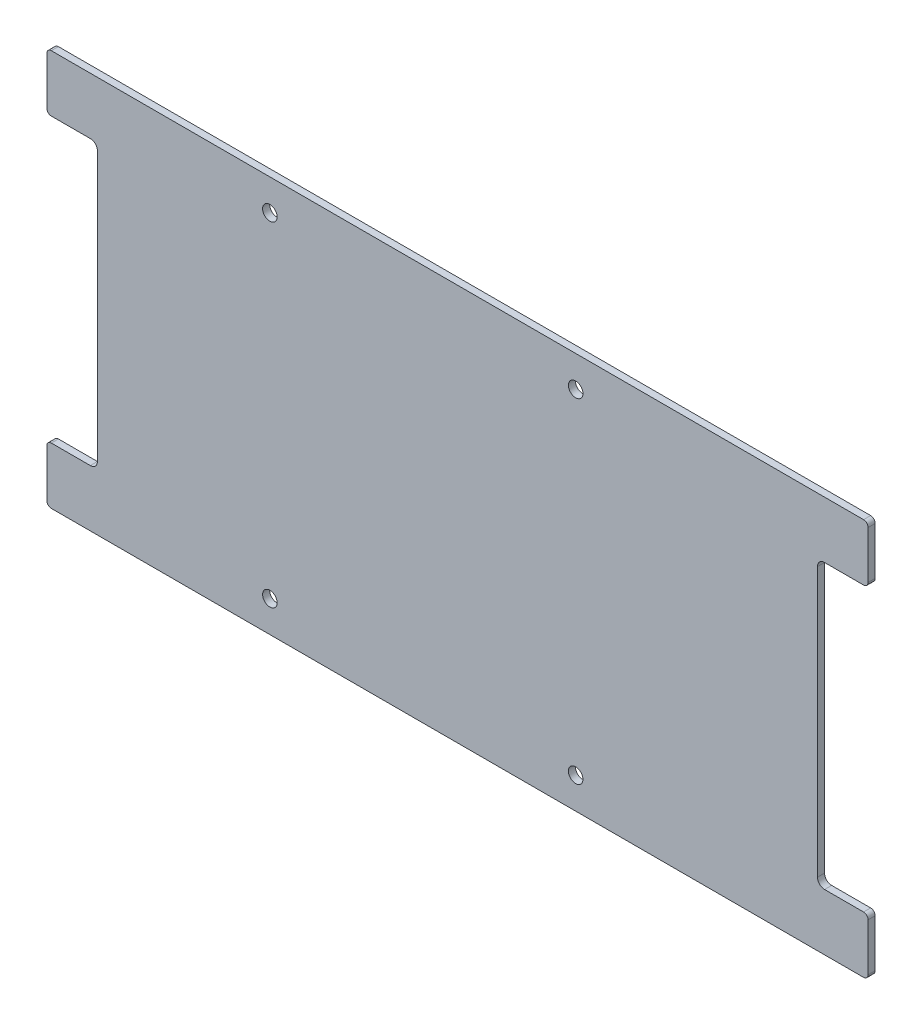
ISO-10303-21;
HEADER;
FILE_DESCRIPTION(('STEP AP214'),'2;1');
FILE_NAME('part.step','',(''),(''),'','','');
FILE_SCHEMA(('AUTOMOTIVE_DESIGN { 1 0 10303 214 1 1 1 1 }'));
ENDSEC;
DATA;
#1=APPLICATION_CONTEXT('core data for automotive mechanical design processes');
#2=APPLICATION_PROTOCOL_DEFINITION('international standard','automotive_design',2000,#1);
#3=PRODUCT_CONTEXT('',#1,'mechanical');
#4=PRODUCT('Part','Part','',(#3));
#5=PRODUCT_RELATED_PRODUCT_CATEGORY('part','',(#4));
#6=PRODUCT_DEFINITION_FORMATION('','',#4);
#7=PRODUCT_DEFINITION_CONTEXT('part definition',#1,'design');
#8=PRODUCT_DEFINITION('design','',#6,#7);
#9=PRODUCT_DEFINITION_SHAPE('','',#8);
#10=(LENGTH_UNIT() NAMED_UNIT(*) SI_UNIT(.MILLI.,.METRE.));
#11=(NAMED_UNIT(*) PLANE_ANGLE_UNIT() SI_UNIT($,.RADIAN.));
#12=(NAMED_UNIT(*) SI_UNIT($,.STERADIAN.) SOLID_ANGLE_UNIT());
#13=UNCERTAINTY_MEASURE_WITH_UNIT(LENGTH_MEASURE(1.E-05),#10,'distance_accuracy_value','');
#14=(GEOMETRIC_REPRESENTATION_CONTEXT(3) GLOBAL_UNCERTAINTY_ASSIGNED_CONTEXT((#13)) GLOBAL_UNIT_ASSIGNED_CONTEXT((#10,
#11,#12)) REPRESENTATION_CONTEXT('',''));
#15=CARTESIAN_POINT('',(0.,0.,0.));
#16=DIRECTION('',(0.,0.,1.));
#17=DIRECTION('',(1.,0.,0.));
#18=AXIS2_PLACEMENT_3D('',#15,#16,#17);
#19=CARTESIAN_POINT('',(0.,0.,-1.5875));
#20=DIRECTION('',(0.,0.,1.));
#21=DIRECTION('',(1.,0.,0.));
#22=AXIS2_PLACEMENT_3D('',#19,#20,#21);
#23=PLANE('',#22);
#24=CARTESIAN_POINT('',(-42.06875,37.465,-1.5875));
#25=DIRECTION('',(0.,0.,1.));
#26=DIRECTION('',(1.,0.,0.));
#27=AXIS2_PLACEMENT_3D('',#24,#25,#26);
#28=CIRCLE('',#27,1.63195);
#29=CARTESIAN_POINT('',(-40.4368,37.465,-1.5875));
#30=VERTEX_POINT('',#29);
#31=EDGE_CURVE('E428',#30,#30,#28,.T.);
#32=ORIENTED_EDGE('',*,*,#31,.T.);
#33=EDGE_LOOP('',(#32));
#34=FACE_BOUND('',#33,.T.);
#35=CARTESIAN_POINT('',(26.51125,37.465,-1.5875));
#36=DIRECTION('',(0.,0.,1.));
#37=DIRECTION('',(1.,0.,0.));
#38=AXIS2_PLACEMENT_3D('',#35,#36,#37);
#39=CIRCLE('',#38,1.63195);
#40=CARTESIAN_POINT('',(28.1432,37.465,-1.5875));
#41=VERTEX_POINT('',#40);
#42=EDGE_CURVE('E434',#41,#41,#39,.T.);
#43=ORIENTED_EDGE('',*,*,#42,.T.);
#44=EDGE_LOOP('',(#43));
#45=FACE_BOUND('',#44,.T.);
#46=CARTESIAN_POINT('',(-42.06875,-37.465,-1.5875));
#47=DIRECTION('',(0.,0.,1.));
#48=DIRECTION('',(1.,0.,0.));
#49=AXIS2_PLACEMENT_3D('',#46,#47,#48);
#50=CIRCLE('',#49,1.63195);
#51=CARTESIAN_POINT('',(-40.4368,-37.465,-1.5875));
#52=VERTEX_POINT('',#51);
#53=EDGE_CURVE('E440',#52,#52,#50,.T.);
#54=ORIENTED_EDGE('',*,*,#53,.T.);
#55=EDGE_LOOP('',(#54));
#56=FACE_BOUND('',#55,.T.);
#57=CARTESIAN_POINT('',(26.51125,-37.465,-1.5875));
#58=DIRECTION('',(0.,0.,1.));
#59=DIRECTION('',(1.,0.,0.));
#60=AXIS2_PLACEMENT_3D('',#57,#58,#59);
#61=CIRCLE('',#60,1.63195);
#62=CARTESIAN_POINT('',(28.1432,-37.465,-1.5875));
#63=VERTEX_POINT('',#62);
#64=EDGE_CURVE('E446',#63,#63,#61,.T.);
#65=ORIENTED_EDGE('',*,*,#64,.T.);
#66=EDGE_LOOP('',(#65));
#67=FACE_BOUND('',#66,.T.);
#68=DIRECTION('',(0.,-1.,0.));
#69=VECTOR('',#68,1.);
#70=CARTESIAN_POINT('',(80.74025,-44.45,-1.58749999999998));
#71=LINE('',#70,#69);
#72=CARTESIAN_POINT('',(80.74025,-30.1625,-1.58749999999998));
#73=VERTEX_POINT('',#72);
#74=CARTESIAN_POINT('',(80.74025,30.1625,-1.58749999999998));
#75=VERTEX_POINT('',#74);
#76=EDGE_CURVE('E460',#73,#75,#71,.F.);
#77=ORIENTED_EDGE('',*,*,#76,.F.);
#78=CARTESIAN_POINT('',(82.32775,-30.1625,-1.58749999999998));
#79=DIRECTION('',(0.,0.,1.));
#80=DIRECTION('',(1.,0.,0.));
#81=AXIS2_PLACEMENT_3D('',#78,#79,#80);
#82=CIRCLE('',#81,1.58750000000002);
#83=CARTESIAN_POINT('',(82.32775,-31.75,-1.58749999999998));
#84=VERTEX_POINT('',#83);
#85=EDGE_CURVE('E421',#73,#84,#82,.T.);
#86=ORIENTED_EDGE('',*,*,#85,.T.);
#87=DIRECTION('',(-1.,0.,0.));
#88=VECTOR('',#87,1.);
#89=CARTESIAN_POINT('',(82.1616243262085,-31.75,-1.58749999999998));
#90=LINE('',#89,#88);
#91=CARTESIAN_POINT('',(91.0759986524171,-31.75,-1.58749999999994));
#92=VERTEX_POINT('',#91);
#93=EDGE_CURVE('E418',#84,#92,#90,.F.);
#94=ORIENTED_EDGE('',*,*,#93,.T.);
#95=CARTESIAN_POINT('',(91.0759986524171,-32.766,-1.58749999999994));
#96=DIRECTION('',(0.,0.,-1.));
#97=DIRECTION('',(-1.,0.,0.));
#98=AXIS2_PLACEMENT_3D('',#95,#96,#97);
#99=CIRCLE('',#98,1.016);
#100=CARTESIAN_POINT('',(92.0919986524171,-32.766,-1.58749999999994));
#101=VERTEX_POINT('',#100);
#102=EDGE_CURVE('E400',#92,#101,#99,.T.);
#103=ORIENTED_EDGE('',*,*,#102,.T.);
#104=DIRECTION('',(0.,-1.,0.));
#105=VECTOR('',#104,1.);
#106=CARTESIAN_POINT('',(92.0919986524171,44.45,-1.58749999999992));
#107=LINE('',#106,#105);
#108=CARTESIAN_POINT('',(92.0919986524171,-43.434,-1.58749999999994));
#109=VERTEX_POINT('',#108);
#110=EDGE_CURVE('E359',#109,#101,#107,.F.);
#111=ORIENTED_EDGE('',*,*,#110,.F.);
#112=CARTESIAN_POINT('',(91.0759986524171,-43.434,-1.58749999999995));
#113=DIRECTION('',(0.,0.,-1.));
#114=DIRECTION('',(-1.,0.,0.));
#115=AXIS2_PLACEMENT_3D('',#112,#113,#114);
#116=CIRCLE('',#115,1.016);
#117=CARTESIAN_POINT('',(91.0759986524171,-44.45,-1.58749999999994));
#118=VERTEX_POINT('',#117);
#119=EDGE_CURVE('E397',#109,#118,#116,.T.);
#120=ORIENTED_EDGE('',*,*,#119,.T.);
#121=DIRECTION('',(1.,0.,0.));
#122=VECTOR('',#121,1.);
#123=CARTESIAN_POINT('',(-83.34375,-44.45,-1.5875));
#124=LINE('',#123,#122);
#125=CARTESIAN_POINT('',(-91.075998652417,-44.45,-1.58749999999998));
#126=VERTEX_POINT('',#125);
#127=EDGE_CURVE('E452',#126,#118,#124,.T.);
#128=ORIENTED_EDGE('',*,*,#127,.F.);
#129=CARTESIAN_POINT('',(-91.075998652417,-43.434,-1.58749999999996));
#130=DIRECTION('',(0.,0.,-1.));
#131=DIRECTION('',(-1.,0.,0.));
#132=AXIS2_PLACEMENT_3D('',#129,#130,#131);
#133=CIRCLE('',#132,1.016);
#134=CARTESIAN_POINT('',(-92.091998652417,-43.434,-1.58749999999996));
#135=VERTEX_POINT('',#134);
#136=EDGE_CURVE('E304',#126,#135,#133,.T.);
#137=ORIENTED_EDGE('',*,*,#136,.T.);
#138=DIRECTION('',(0.,1.,0.));
#139=VECTOR('',#138,1.);
#140=CARTESIAN_POINT('',(-92.091998652417,-44.45,-1.58749999999996));
#141=LINE('',#140,#139);
#142=CARTESIAN_POINT('',(-92.091998652417,-32.766,-1.58749999999996));
#143=VERTEX_POINT('',#142);
#144=EDGE_CURVE('E313',#143,#135,#141,.F.);
#145=ORIENTED_EDGE('',*,*,#144,.F.);
#146=CARTESIAN_POINT('',(-91.075998652417,-32.766,-1.58749999999996));
#147=DIRECTION('',(0.,0.,-1.));
#148=DIRECTION('',(-1.,0.,0.));
#149=AXIS2_PLACEMENT_3D('',#146,#147,#148);
#150=CIRCLE('',#149,1.016);
#151=CARTESIAN_POINT('',(-91.075998652417,-31.75,-1.58749999999996));
#152=VERTEX_POINT('',#151);
#153=EDGE_CURVE('E309',#143,#152,#150,.T.);
#154=ORIENTED_EDGE('',*,*,#153,.T.);
#155=DIRECTION('',(-1.,0.,0.));
#156=VECTOR('',#155,1.);
#157=CARTESIAN_POINT('',(-82.1616243262085,-31.75,-1.58750000000002));
#158=LINE('',#157,#156);
#159=CARTESIAN_POINT('',(-82.32775,-31.75,-1.58750000000002));
#160=VERTEX_POINT('',#159);
#161=EDGE_CURVE('E289',#152,#160,#158,.F.);
#162=ORIENTED_EDGE('',*,*,#161,.T.);
#163=CARTESIAN_POINT('',(-82.32775,-30.1625,-1.58750000000002));
#164=DIRECTION('',(0.,0.,1.));
#165=DIRECTION('',(1.,0.,0.));
#166=AXIS2_PLACEMENT_3D('',#163,#164,#165);
#167=CIRCLE('',#166,1.58750000000002);
#168=CARTESIAN_POINT('',(-80.74025,-30.1625,-1.58750000000002));
#169=VERTEX_POINT('',#168);
#170=EDGE_CURVE('E351',#160,#169,#167,.T.);
#171=ORIENTED_EDGE('',*,*,#170,.T.);
#172=DIRECTION('',(0.,1.,0.));
#173=VECTOR('',#172,1.);
#174=CARTESIAN_POINT('',(-80.74025,44.45,-1.58750000000002));
#175=LINE('',#174,#173);
#176=CARTESIAN_POINT('',(-80.74025,30.1625,-1.58750000000002));
#177=VERTEX_POINT('',#176);
#178=EDGE_CURVE('E458',#177,#169,#175,.F.);
#179=ORIENTED_EDGE('',*,*,#178,.F.);
#180=CARTESIAN_POINT('',(-82.32775,30.1625,-1.58750000000002));
#181=DIRECTION('',(0.,0.,1.));
#182=DIRECTION('',(1.,0.,0.));
#183=AXIS2_PLACEMENT_3D('',#180,#181,#182);
#184=CIRCLE('',#183,1.58750000000001);
#185=CARTESIAN_POINT('',(-82.32775,31.75,-1.58750000000002));
#186=VERTEX_POINT('',#185);
#187=EDGE_CURVE('E347',#177,#186,#184,.T.);
#188=ORIENTED_EDGE('',*,*,#187,.T.);
#189=DIRECTION('',(-1.,0.,0.));
#190=VECTOR('',#189,1.);
#191=CARTESIAN_POINT('',(-82.1616243262085,31.75,-1.58750000000002));
#192=LINE('',#191,#190);
#193=CARTESIAN_POINT('',(-91.075998652417,31.75,-1.58749999999994));
#194=VERTEX_POINT('',#193);
#195=EDGE_CURVE('E345',#186,#194,#192,.T.);
#196=ORIENTED_EDGE('',*,*,#195,.T.);
#197=CARTESIAN_POINT('',(-91.075998652417,32.766,-1.58749999999995));
#198=DIRECTION('',(0.,0.,-1.));
#199=DIRECTION('',(-1.,0.,0.));
#200=AXIS2_PLACEMENT_3D('',#197,#198,#199);
#201=CIRCLE('',#200,1.016);
#202=CARTESIAN_POINT('',(-92.091998652417,32.766,-1.58749999999994));
#203=VERTEX_POINT('',#202);
#204=EDGE_CURVE('E335',#194,#203,#201,.T.);
#205=ORIENTED_EDGE('',*,*,#204,.T.);
#206=DIRECTION('',(0.,1.,0.));
#207=VECTOR('',#206,1.);
#208=CARTESIAN_POINT('',(-92.091998652417,-44.45,-1.58749999999996));
#209=LINE('',#208,#207);
#210=CARTESIAN_POINT('',(-92.091998652417,43.434,-1.58749999999994));
#211=VERTEX_POINT('',#210);
#212=EDGE_CURVE('E292',#211,#203,#209,.F.);
#213=ORIENTED_EDGE('',*,*,#212,.F.);
#214=CARTESIAN_POINT('',(-91.075998652417,43.434,-1.58749999999994));
#215=DIRECTION('',(0.,0.,-1.));
#216=DIRECTION('',(-1.,0.,0.));
#217=AXIS2_PLACEMENT_3D('',#214,#215,#216);
#218=CIRCLE('',#217,1.016);
#219=CARTESIAN_POINT('',(-91.075998652417,44.45,-1.58749999999994));
#220=VERTEX_POINT('',#219);
#221=EDGE_CURVE('E332',#211,#220,#218,.T.);
#222=ORIENTED_EDGE('',*,*,#221,.T.);
#223=DIRECTION('',(-1.,0.,0.));
#224=VECTOR('',#223,1.);
#225=CARTESIAN_POINT('',(-83.34375,44.45,-1.5875));
#226=LINE('',#225,#224);
#227=CARTESIAN_POINT('',(91.0759986524171,44.45,-1.58749999999994));
#228=VERTEX_POINT('',#227);
#229=EDGE_CURVE('E450',#228,#220,#226,.T.);
#230=ORIENTED_EDGE('',*,*,#229,.F.);
#231=CARTESIAN_POINT('',(91.0759986524171,43.434,-1.58749999999994));
#232=DIRECTION('',(0.,0.,-1.));
#233=DIRECTION('',(-1.,0.,0.));
#234=AXIS2_PLACEMENT_3D('',#231,#232,#233);
#235=CIRCLE('',#234,1.016);
#236=CARTESIAN_POINT('',(92.0919986524171,43.434,-1.58749999999992));
#237=VERTEX_POINT('',#236);
#238=EDGE_CURVE('E374',#228,#237,#235,.T.);
#239=ORIENTED_EDGE('',*,*,#238,.T.);
#240=DIRECTION('',(0.,-1.,0.));
#241=VECTOR('',#240,1.);
#242=CARTESIAN_POINT('',(92.0919986524171,44.45,-1.58749999999992));
#243=LINE('',#242,#241);
#244=CARTESIAN_POINT('',(92.0919986524171,32.766,-1.58749999999992));
#245=VERTEX_POINT('',#244);
#246=EDGE_CURVE('E355',#245,#237,#243,.F.);
#247=ORIENTED_EDGE('',*,*,#246,.F.);
#248=CARTESIAN_POINT('',(91.0759986524171,32.766,-1.58749999999994));
#249=DIRECTION('',(0.,0.,-1.));
#250=DIRECTION('',(-1.,0.,0.));
#251=AXIS2_PLACEMENT_3D('',#248,#249,#250);
#252=CIRCLE('',#251,1.016);
#253=CARTESIAN_POINT('',(91.0759986524171,31.75,-1.58749999999994));
#254=VERTEX_POINT('',#253);
#255=EDGE_CURVE('E371',#245,#254,#252,.T.);
#256=ORIENTED_EDGE('',*,*,#255,.T.);
#257=DIRECTION('',(-1.,0.,0.));
#258=VECTOR('',#257,1.);
#259=CARTESIAN_POINT('',(82.1616243262085,31.75,-1.58749999999998));
#260=LINE('',#259,#258);
#261=CARTESIAN_POINT('',(82.32775,31.75,-1.58749999999998));
#262=VERTEX_POINT('',#261);
#263=EDGE_CURVE('E409',#254,#262,#260,.T.);
#264=ORIENTED_EDGE('',*,*,#263,.T.);
#265=CARTESIAN_POINT('',(82.32775,30.1625,-1.58749999999998));
#266=DIRECTION('',(0.,0.,1.));
#267=DIRECTION('',(1.,0.,0.));
#268=AXIS2_PLACEMENT_3D('',#265,#266,#267);
#269=CIRCLE('',#268,1.58750000000002);
#270=EDGE_CURVE('E412',#262,#75,#269,.T.);
#271=ORIENTED_EDGE('',*,*,#270,.T.);
#272=EDGE_LOOP('',(#77,#86,#94,#103,#111,#120,#128,#137,#145,#154,#162,#171,#179,#188,#196,#205,
#213,#222,#230,#239,#247,#256,#264,#271));
#273=FACE_BOUND('',#272,.T.);
#274=ADVANCED_FACE('F115',(#34,#45,#56,#67,#273),#23,.F.);
#275=CARTESIAN_POINT('',(0.,0.,0.));
#276=DIRECTION('',(0.,0.,1.));
#277=DIRECTION('',(1.,0.,0.));
#278=AXIS2_PLACEMENT_3D('',#275,#276,#277);
#279=PLANE('',#278);
#280=CARTESIAN_POINT('',(-42.06875,37.465,0.));
#281=DIRECTION('',(0.,0.,1.));
#282=DIRECTION('',(1.,0.,0.));
#283=AXIS2_PLACEMENT_3D('',#280,#281,#282);
#284=CIRCLE('',#283,1.63195);
#285=CARTESIAN_POINT('',(-40.4368,37.465,0.));
#286=VERTEX_POINT('',#285);
#287=EDGE_CURVE('E425',#286,#286,#284,.T.);
#288=ORIENTED_EDGE('',*,*,#287,.F.);
#289=EDGE_LOOP('',(#288));
#290=FACE_BOUND('',#289,.T.);
#291=CARTESIAN_POINT('',(26.51125,37.465,0.));
#292=DIRECTION('',(0.,0.,1.));
#293=DIRECTION('',(1.,0.,0.));
#294=AXIS2_PLACEMENT_3D('',#291,#292,#293);
#295=CIRCLE('',#294,1.63195);
#296=CARTESIAN_POINT('',(28.1432,37.465,0.));
#297=VERTEX_POINT('',#296);
#298=EDGE_CURVE('E431',#297,#297,#295,.T.);
#299=ORIENTED_EDGE('',*,*,#298,.F.);
#300=EDGE_LOOP('',(#299));
#301=FACE_BOUND('',#300,.T.);
#302=CARTESIAN_POINT('',(-42.06875,-37.465,0.));
#303=DIRECTION('',(0.,0.,1.));
#304=DIRECTION('',(1.,0.,0.));
#305=AXIS2_PLACEMENT_3D('',#302,#303,#304);
#306=CIRCLE('',#305,1.63195);
#307=CARTESIAN_POINT('',(-40.4368,-37.465,0.));
#308=VERTEX_POINT('',#307);
#309=EDGE_CURVE('E437',#308,#308,#306,.T.);
#310=ORIENTED_EDGE('',*,*,#309,.F.);
#311=EDGE_LOOP('',(#310));
#312=FACE_BOUND('',#311,.T.);
#313=CARTESIAN_POINT('',(26.51125,-37.465,0.));
#314=DIRECTION('',(0.,0.,1.));
#315=DIRECTION('',(1.,0.,0.));
#316=AXIS2_PLACEMENT_3D('',#313,#314,#315);
#317=CIRCLE('',#316,1.63195);
#318=CARTESIAN_POINT('',(28.1432,-37.465,0.));
#319=VERTEX_POINT('',#318);
#320=EDGE_CURVE('E443',#319,#319,#317,.T.);
#321=ORIENTED_EDGE('',*,*,#320,.F.);
#322=EDGE_LOOP('',(#321));
#323=FACE_BOUND('',#322,.T.);
#324=DIRECTION('',(1.,0.,0.));
#325=VECTOR('',#324,1.);
#326=CARTESIAN_POINT('',(-83.34375,-44.45,0.));
#327=LINE('',#326,#325);
#328=CARTESIAN_POINT('',(-91.075998652417,-44.45,0.));
#329=VERTEX_POINT('',#328);
#330=CARTESIAN_POINT('',(91.0759986524171,-44.45,0.));
#331=VERTEX_POINT('',#330);
#332=EDGE_CURVE('E453',#329,#331,#327,.T.);
#333=ORIENTED_EDGE('',*,*,#332,.T.);
#334=CARTESIAN_POINT('',(91.0759986524171,-43.434,0.));
#335=DIRECTION('',(0.,0.,-1.));
#336=DIRECTION('',(-1.,0.,0.));
#337=AXIS2_PLACEMENT_3D('',#334,#335,#336);
#338=CIRCLE('',#337,1.016);
#339=CARTESIAN_POINT('',(92.0919986524171,-43.434,0.));
#340=VERTEX_POINT('',#339);
#341=EDGE_CURVE('E386',#331,#340,#338,.F.);
#342=ORIENTED_EDGE('',*,*,#341,.T.);
#343=DIRECTION('',(0.,1.,0.));
#344=VECTOR('',#343,1.);
#345=CARTESIAN_POINT('',(92.0919986524171,0.,0.));
#346=LINE('',#345,#344);
#347=CARTESIAN_POINT('',(92.0919986524171,-32.766,0.));
#348=VERTEX_POINT('',#347);
#349=EDGE_CURVE('E391',#340,#348,#346,.T.);
#350=ORIENTED_EDGE('',*,*,#349,.T.);
#351=CARTESIAN_POINT('',(91.0759986524171,-32.766,0.));
#352=DIRECTION('',(0.,0.,-1.));
#353=DIRECTION('',(-1.,0.,0.));
#354=AXIS2_PLACEMENT_3D('',#351,#352,#353);
#355=CIRCLE('',#354,1.016);
#356=CARTESIAN_POINT('',(91.0759986524171,-31.75,0.));
#357=VERTEX_POINT('',#356);
#358=EDGE_CURVE('E388',#348,#357,#355,.F.);
#359=ORIENTED_EDGE('',*,*,#358,.T.);
#360=DIRECTION('',(-1.,0.,0.));
#361=VECTOR('',#360,1.);
#362=CARTESIAN_POINT('',(82.1616243262085,-31.75,0.));
#363=LINE('',#362,#361);
#364=CARTESIAN_POINT('',(82.32775,-31.75,0.));
#365=VERTEX_POINT('',#364);
#366=EDGE_CURVE('E422',#365,#357,#363,.F.);
#367=ORIENTED_EDGE('',*,*,#366,.F.);
#368=CARTESIAN_POINT('',(82.32775,-30.1625,0.));
#369=DIRECTION('',(0.,0.,1.));
#370=DIRECTION('',(1.,0.,0.));
#371=AXIS2_PLACEMENT_3D('',#368,#369,#370);
#372=CIRCLE('',#371,1.58750000000002);
#373=CARTESIAN_POINT('',(80.74025,-30.1625,0.));
#374=VERTEX_POINT('',#373);
#375=EDGE_CURVE('E417',#374,#365,#372,.T.);
#376=ORIENTED_EDGE('',*,*,#375,.F.);
#377=DIRECTION('',(0.,1.,0.));
#378=VECTOR('',#377,1.);
#379=CARTESIAN_POINT('',(80.74025,31.75,0.));
#380=LINE('',#379,#378);
#381=CARTESIAN_POINT('',(80.74025,30.1625044331432,0.));
#382=VERTEX_POINT('',#381);
#383=EDGE_CURVE('E449',#374,#382,#380,.T.);
#384=ORIENTED_EDGE('',*,*,#383,.T.);
#385=CARTESIAN_POINT('',(82.32775,30.1625,0.));
#386=DIRECTION('',(0.,0.,1.));
#387=DIRECTION('',(1.,0.,0.));
#388=AXIS2_PLACEMENT_3D('',#385,#386,#387);
#389=CIRCLE('',#388,1.58750000000002);
#390=CARTESIAN_POINT('',(82.32775,31.75,0.));
#391=VERTEX_POINT('',#390);
#392=EDGE_CURVE('E139',#391,#382,#389,.T.);
#393=ORIENTED_EDGE('',*,*,#392,.F.);
#394=DIRECTION('',(-1.,0.,0.));
#395=VECTOR('',#394,1.);
#396=CARTESIAN_POINT('',(82.1616243262085,31.75,0.));
#397=LINE('',#396,#395);
#398=CARTESIAN_POINT('',(91.0759986524171,31.75,0.));
#399=VERTEX_POINT('',#398);
#400=EDGE_CURVE('E385',#399,#391,#397,.T.);
#401=ORIENTED_EDGE('',*,*,#400,.F.);
#402=CARTESIAN_POINT('',(91.0759986524171,32.766,0.));
#403=DIRECTION('',(0.,0.,-1.));
#404=DIRECTION('',(-1.,0.,0.));
#405=AXIS2_PLACEMENT_3D('',#402,#403,#404);
#406=CIRCLE('',#405,1.016);
#407=CARTESIAN_POINT('',(92.0919986524171,32.766,0.));
#408=VERTEX_POINT('',#407);
#409=EDGE_CURVE('E360',#399,#408,#406,.F.);
#410=ORIENTED_EDGE('',*,*,#409,.T.);
#411=DIRECTION('',(0.,1.,0.));
#412=VECTOR('',#411,1.);
#413=CARTESIAN_POINT('',(92.0919986524171,0.,0.));
#414=LINE('',#413,#412);
#415=CARTESIAN_POINT('',(92.0919986524171,43.434,0.));
#416=VERTEX_POINT('',#415);
#417=EDGE_CURVE('E365',#408,#416,#414,.T.);
#418=ORIENTED_EDGE('',*,*,#417,.T.);
#419=CARTESIAN_POINT('',(91.0759986524171,43.434,0.));
#420=DIRECTION('',(0.,0.,-1.));
#421=DIRECTION('',(-1.,0.,0.));
#422=AXIS2_PLACEMENT_3D('',#419,#420,#421);
#423=CIRCLE('',#422,1.016);
#424=CARTESIAN_POINT('',(91.0759986524171,44.45,0.));
#425=VERTEX_POINT('',#424);
#426=EDGE_CURVE('E362',#416,#425,#423,.F.);
#427=ORIENTED_EDGE('',*,*,#426,.T.);
#428=DIRECTION('',(-1.,0.,0.));
#429=VECTOR('',#428,1.);
#430=CARTESIAN_POINT('',(-83.34375,44.45,0.));
#431=LINE('',#430,#429);
#432=CARTESIAN_POINT('',(-91.075998652417,44.45,0.));
#433=VERTEX_POINT('',#432);
#434=EDGE_CURVE('E456',#425,#433,#431,.T.);
#435=ORIENTED_EDGE('',*,*,#434,.T.);
#436=CARTESIAN_POINT('',(-91.075998652417,43.434,0.));
#437=DIRECTION('',(0.,0.,-1.));
#438=DIRECTION('',(-1.,0.,0.));
#439=AXIS2_PLACEMENT_3D('',#436,#437,#438);
#440=CIRCLE('',#439,1.016);
#441=CARTESIAN_POINT('',(-92.091998652417,43.434,0.));
#442=VERTEX_POINT('',#441);
#443=EDGE_CURVE('E321',#433,#442,#440,.F.);
#444=ORIENTED_EDGE('',*,*,#443,.T.);
#445=DIRECTION('',(0.,-1.,0.));
#446=VECTOR('',#445,1.);
#447=CARTESIAN_POINT('',(-92.091998652417,0.,0.));
#448=LINE('',#447,#446);
#449=CARTESIAN_POINT('',(-92.091998652417,32.766,0.));
#450=VERTEX_POINT('',#449);
#451=EDGE_CURVE('E326',#442,#450,#448,.T.);
#452=ORIENTED_EDGE('',*,*,#451,.T.);
#453=CARTESIAN_POINT('',(-91.075998652417,32.766,0.));
#454=DIRECTION('',(0.,0.,-1.));
#455=DIRECTION('',(-1.,0.,0.));
#456=AXIS2_PLACEMENT_3D('',#453,#454,#455);
#457=CIRCLE('',#456,1.016);
#458=CARTESIAN_POINT('',(-91.075998652417,31.75,0.));
#459=VERTEX_POINT('',#458);
#460=EDGE_CURVE('E323',#450,#459,#457,.F.);
#461=ORIENTED_EDGE('',*,*,#460,.T.);
#462=DIRECTION('',(-1.,0.,0.));
#463=VECTOR('',#462,1.);
#464=CARTESIAN_POINT('',(-82.1616243262085,31.75,0.));
#465=LINE('',#464,#463);
#466=CARTESIAN_POINT('',(-82.32775,31.75,0.));
#467=VERTEX_POINT('',#466);
#468=EDGE_CURVE('E348',#467,#459,#465,.T.);
#469=ORIENTED_EDGE('',*,*,#468,.F.);
#470=CARTESIAN_POINT('',(-82.32775,30.1625,0.));
#471=DIRECTION('',(0.,0.,1.));
#472=DIRECTION('',(1.,0.,0.));
#473=AXIS2_PLACEMENT_3D('',#470,#471,#472);
#474=CIRCLE('',#473,1.58750000000001);
#475=CARTESIAN_POINT('',(-80.74025,30.1625,0.));
#476=VERTEX_POINT('',#475);
#477=EDGE_CURVE('E320',#476,#467,#474,.T.);
#478=ORIENTED_EDGE('',*,*,#477,.F.);
#479=DIRECTION('',(0.,1.,0.));
#480=VECTOR('',#479,1.);
#481=CARTESIAN_POINT('',(-80.74025,31.75,0.));
#482=LINE('',#481,#480);
#483=CARTESIAN_POINT('',(-80.74025,-30.1625044364664,0.));
#484=VERTEX_POINT('',#483);
#485=EDGE_CURVE('E463',#484,#476,#482,.T.);
#486=ORIENTED_EDGE('',*,*,#485,.F.);
#487=CARTESIAN_POINT('',(-82.32775,-30.1625,0.));
#488=DIRECTION('',(0.,0.,1.));
#489=DIRECTION('',(1.,0.,0.));
#490=AXIS2_PLACEMENT_3D('',#487,#488,#489);
#491=CIRCLE('',#490,1.58750000000002);
#492=CARTESIAN_POINT('',(-82.32775,-31.75,0.));
#493=VERTEX_POINT('',#492);
#494=EDGE_CURVE('E131',#493,#484,#491,.T.);
#495=ORIENTED_EDGE('',*,*,#494,.F.);
#496=DIRECTION('',(-1.,0.,0.));
#497=VECTOR('',#496,1.);
#498=CARTESIAN_POINT('',(-82.1616243262085,-31.75,0.));
#499=LINE('',#498,#497);
#500=CARTESIAN_POINT('',(-91.075998652417,-31.75,0.));
#501=VERTEX_POINT('',#500);
#502=EDGE_CURVE('E276',#501,#493,#499,.F.);
#503=ORIENTED_EDGE('',*,*,#502,.F.);
#504=CARTESIAN_POINT('',(-91.075998652417,-32.766,0.));
#505=DIRECTION('',(0.,0.,-1.));
#506=DIRECTION('',(-1.,0.,0.));
#507=AXIS2_PLACEMENT_3D('',#504,#505,#506);
#508=CIRCLE('',#507,1.016);
#509=CARTESIAN_POINT('',(-92.091998652417,-32.766,0.));
#510=VERTEX_POINT('',#509);
#511=EDGE_CURVE('E280',#501,#510,#508,.F.);
#512=ORIENTED_EDGE('',*,*,#511,.T.);
#513=DIRECTION('',(0.,-1.,0.));
#514=VECTOR('',#513,1.);
#515=CARTESIAN_POINT('',(-92.091998652417,0.,0.));
#516=LINE('',#515,#514);
#517=CARTESIAN_POINT('',(-92.091998652417,-43.434,0.));
#518=VERTEX_POINT('',#517);
#519=EDGE_CURVE('E299',#510,#518,#516,.T.);
#520=ORIENTED_EDGE('',*,*,#519,.T.);
#521=CARTESIAN_POINT('',(-91.075998652417,-43.434,0.));
#522=DIRECTION('',(0.,0.,-1.));
#523=DIRECTION('',(-1.,0.,0.));
#524=AXIS2_PLACEMENT_3D('',#521,#522,#523);
#525=CIRCLE('',#524,1.016);
#526=EDGE_CURVE('E293',#518,#329,#525,.F.);
#527=ORIENTED_EDGE('',*,*,#526,.T.);
#528=EDGE_LOOP('',(#333,#342,#350,#359,#367,#376,#384,#393,#401,#410,#418,#427,#435,#444,#452,
#461,#469,#478,#486,#495,#503,#512,#520,#527));
#529=FACE_BOUND('',#528,.T.);
#530=ADVANCED_FACE('F117',(#290,#301,#312,#323,#529),#279,.T.);
#531=CARTESIAN_POINT('',(-83.34375,-44.45,-1.5875));
#532=DIRECTION('',(0.,-1.,0.));
#533=DIRECTION('',(0.,0.,-1.));
#534=AXIS2_PLACEMENT_3D('',#531,#532,#533);
#535=PLANE('',#534);
#536=ORIENTED_EDGE('',*,*,#127,.T.);
#537=DIRECTION('',(0.,0.,-1.));
#538=VECTOR('',#537,1.);
#539=CARTESIAN_POINT('',(91.0759986524171,-44.45,0.));
#540=LINE('',#539,#538);
#541=EDGE_CURVE('E382',#118,#331,#540,.F.);
#542=ORIENTED_EDGE('',*,*,#541,.T.);
#543=ORIENTED_EDGE('',*,*,#332,.F.);
#544=DIRECTION('',(0.,0.,-1.));
#545=VECTOR('',#544,1.);
#546=CARTESIAN_POINT('',(-91.075998652417,-44.45,0.));
#547=LINE('',#546,#545);
#548=EDGE_CURVE('E300',#329,#126,#547,.T.);
#549=ORIENTED_EDGE('',*,*,#548,.T.);
#550=EDGE_LOOP('',(#536,#542,#543,#549));
#551=FACE_BOUND('',#550,.T.);
#552=ADVANCED_FACE('F578',(#551),#535,.T.);
#553=CARTESIAN_POINT('',(-83.34375,44.45,-1.5875));
#554=DIRECTION('',(0.,1.,0.));
#555=DIRECTION('',(0.,0.,1.));
#556=AXIS2_PLACEMENT_3D('',#553,#554,#555);
#557=PLANE('',#556);
#558=ORIENTED_EDGE('',*,*,#434,.F.);
#559=DIRECTION('',(0.,0.,-1.));
#560=VECTOR('',#559,1.);
#561=CARTESIAN_POINT('',(91.0759986524171,44.45,0.));
#562=LINE('',#561,#560);
#563=EDGE_CURVE('E368',#425,#228,#562,.T.);
#564=ORIENTED_EDGE('',*,*,#563,.T.);
#565=ORIENTED_EDGE('',*,*,#229,.T.);
#566=DIRECTION('',(0.,0.,-1.));
#567=VECTOR('',#566,1.);
#568=CARTESIAN_POINT('',(-91.075998652417,44.45,0.));
#569=LINE('',#568,#567);
#570=EDGE_CURVE('E317',#220,#433,#569,.F.);
#571=ORIENTED_EDGE('',*,*,#570,.T.);
#572=EDGE_LOOP('',(#558,#564,#565,#571));
#573=FACE_BOUND('',#572,.T.);
#574=ADVANCED_FACE('F583',(#573),#557,.T.);
#575=CARTESIAN_POINT('',(-80.74025,31.75,-11.1125));
#576=DIRECTION('',(1.,0.,0.));
#577=DIRECTION('',(0.,0.,-1.));
#578=AXIS2_PLACEMENT_3D('',#575,#576,#577);
#579=PLANE('',#578);
#580=ORIENTED_EDGE('',*,*,#178,.T.);
#581=CARTESIAN_POINT('',(-80.74025,-30.1625,0.));
#582=DIRECTION('',(0.,0.,-1.));
#583=VECTOR('',#582,1.);
#584=LINE('',#581,#583);
#585=EDGE_CURVE('E124',#484,#169,#584,.T.);
#586=ORIENTED_EDGE('',*,*,#585,.F.);
#587=ORIENTED_EDGE('',*,*,#485,.T.);
#588=CARTESIAN_POINT('',(-80.74025,30.1625,0.));
#589=DIRECTION('',(0.,0.,-1.));
#590=VECTOR('',#589,1.);
#591=LINE('',#588,#590);
#592=EDGE_CURVE('E13',#476,#177,#591,.T.);
#593=ORIENTED_EDGE('',*,*,#592,.T.);
#594=EDGE_LOOP('',(#580,#586,#587,#593));
#595=FACE_BOUND('',#594,.T.);
#596=ADVANCED_FACE('F487',(#595),#579,.F.);
#597=CARTESIAN_POINT('',(80.74025,31.75,-11.1125));
#598=DIRECTION('',(1.,0.,0.));
#599=DIRECTION('',(0.,0.,-1.));
#600=AXIS2_PLACEMENT_3D('',#597,#598,#599);
#601=PLANE('',#600);
#602=ORIENTED_EDGE('',*,*,#76,.T.);
#603=CARTESIAN_POINT('',(80.74025,30.1625,0.));
#604=DIRECTION('',(0.,0.,-1.));
#605=VECTOR('',#604,1.);
#606=LINE('',#603,#605);
#607=EDGE_CURVE('E455',#382,#75,#606,.T.);
#608=ORIENTED_EDGE('',*,*,#607,.F.);
#609=ORIENTED_EDGE('',*,*,#383,.F.);
#610=CARTESIAN_POINT('',(80.74025,-30.1625,0.));
#611=DIRECTION('',(0.,0.,-1.));
#612=VECTOR('',#611,1.);
#613=LINE('',#610,#612);
#614=EDGE_CURVE('E470',#374,#73,#613,.T.);
#615=ORIENTED_EDGE('',*,*,#614,.T.);
#616=EDGE_LOOP('',(#602,#608,#609,#615));
#617=FACE_BOUND('',#616,.T.);
#618=ADVANCED_FACE('F476',(#617),#601,.T.);
#619=CARTESIAN_POINT('',(26.51125,-37.465,0.));
#620=DIRECTION('',(0.,0.,1.));
#621=DIRECTION('',(1.,0.,0.));
#622=AXIS2_PLACEMENT_3D('',#619,#620,#621);
#623=CYLINDRICAL_SURFACE('',#622,1.63195);
#624=ORIENTED_EDGE('',*,*,#320,.T.);
#625=EDGE_LOOP('',(#624));
#626=FACE_BOUND('',#625,.T.);
#627=ORIENTED_EDGE('',*,*,#64,.F.);
#628=EDGE_LOOP('',(#627));
#629=FACE_BOUND('',#628,.T.);
#630=ADVANCED_FACE('F486',(#626,#629),#623,.F.);
#631=CARTESIAN_POINT('',(-42.06875,-37.465,0.));
#632=DIRECTION('',(0.,0.,1.));
#633=DIRECTION('',(1.,0.,0.));
#634=AXIS2_PLACEMENT_3D('',#631,#632,#633);
#635=CYLINDRICAL_SURFACE('',#634,1.63195);
#636=ORIENTED_EDGE('',*,*,#309,.T.);
#637=EDGE_LOOP('',(#636));
#638=FACE_BOUND('',#637,.T.);
#639=ORIENTED_EDGE('',*,*,#53,.F.);
#640=EDGE_LOOP('',(#639));
#641=FACE_BOUND('',#640,.T.);
#642=ADVANCED_FACE('F563',(#638,#641),#635,.F.);
#643=CARTESIAN_POINT('',(26.51125,37.465,0.));
#644=DIRECTION('',(0.,0.,1.));
#645=DIRECTION('',(1.,0.,0.));
#646=AXIS2_PLACEMENT_3D('',#643,#644,#645);
#647=CYLINDRICAL_SURFACE('',#646,1.63195);
#648=ORIENTED_EDGE('',*,*,#298,.T.);
#649=EDGE_LOOP('',(#648));
#650=FACE_BOUND('',#649,.T.);
#651=ORIENTED_EDGE('',*,*,#42,.F.);
#652=EDGE_LOOP('',(#651));
#653=FACE_BOUND('',#652,.T.);
#654=ADVANCED_FACE('F560',(#650,#653),#647,.F.);
#655=CARTESIAN_POINT('',(-42.06875,37.465,0.));
#656=DIRECTION('',(0.,0.,1.));
#657=DIRECTION('',(1.,0.,0.));
#658=AXIS2_PLACEMENT_3D('',#655,#656,#657);
#659=CYLINDRICAL_SURFACE('',#658,1.63195);
#660=ORIENTED_EDGE('',*,*,#287,.T.);
#661=EDGE_LOOP('',(#660));
#662=FACE_BOUND('',#661,.T.);
#663=ORIENTED_EDGE('',*,*,#31,.F.);
#664=EDGE_LOOP('',(#663));
#665=FACE_BOUND('',#664,.T.);
#666=ADVANCED_FACE('F556',(#662,#665),#659,.F.);
#667=CARTESIAN_POINT('',(82.32775,-30.1625,-0.793749999999981));
#668=DIRECTION('',(0.,0.,-1.));
#669=DIRECTION('',(-1.,0.,0.));
#670=AXIS2_PLACEMENT_3D('',#667,#668,#669);
#671=CYLINDRICAL_SURFACE('',#670,1.58750000000002);
#672=ORIENTED_EDGE('',*,*,#614,.F.);
#673=ORIENTED_EDGE('',*,*,#375,.T.);
#674=DIRECTION('',(0.,0.,-1.));
#675=VECTOR('',#674,1.);
#676=CARTESIAN_POINT('',(82.32775,-31.75,-0.793749999999981));
#677=LINE('',#676,#675);
#678=EDGE_CURVE('E420',#365,#84,#677,.T.);
#679=ORIENTED_EDGE('',*,*,#678,.T.);
#680=ORIENTED_EDGE('',*,*,#85,.F.);
#681=EDGE_LOOP('',(#672,#673,#679,#680));
#682=FACE_BOUND('',#681,.T.);
#683=ADVANCED_FACE('F545',(#682),#671,.F.);
#684=CARTESIAN_POINT('',(82.1616243262085,-31.75,-0.793749999999981));
#685=DIRECTION('',(0.,-1.,0.));
#686=DIRECTION('',(-1.,0.,0.));
#687=AXIS2_PLACEMENT_3D('',#684,#685,#686);
#688=PLANE('',#687);
#689=ORIENTED_EDGE('',*,*,#678,.F.);
#690=ORIENTED_EDGE('',*,*,#366,.T.);
#691=DIRECTION('',(0.,0.,-1.));
#692=VECTOR('',#691,1.);
#693=CARTESIAN_POINT('',(91.0759986524171,-31.75,-1.58749999999994));
#694=LINE('',#693,#692);
#695=EDGE_CURVE('E394',#357,#92,#694,.T.);
#696=ORIENTED_EDGE('',*,*,#695,.T.);
#697=ORIENTED_EDGE('',*,*,#93,.F.);
#698=EDGE_LOOP('',(#689,#690,#696,#697));
#699=FACE_BOUND('',#698,.T.);
#700=ADVANCED_FACE('F555',(#699),#688,.F.);
#701=CARTESIAN_POINT('',(82.1616243262085,31.75,-0.793749999999981));
#702=DIRECTION('',(0.,-1.,0.));
#703=DIRECTION('',(-1.,0.,0.));
#704=AXIS2_PLACEMENT_3D('',#701,#702,#703);
#705=PLANE('',#704);
#706=ORIENTED_EDGE('',*,*,#263,.F.);
#707=DIRECTION('',(0.,0.,1.));
#708=VECTOR('',#707,1.);
#709=CARTESIAN_POINT('',(91.0759986524171,31.75,0.));
#710=LINE('',#709,#708);
#711=EDGE_CURVE('E356',#254,#399,#710,.T.);
#712=ORIENTED_EDGE('',*,*,#711,.T.);
#713=ORIENTED_EDGE('',*,*,#400,.T.);
#714=DIRECTION('',(0.,0.,-1.));
#715=VECTOR('',#714,1.);
#716=CARTESIAN_POINT('',(82.32775,31.75,-0.793749999999981));
#717=LINE('',#716,#715);
#718=EDGE_CURVE('E415',#391,#262,#717,.T.);
#719=ORIENTED_EDGE('',*,*,#718,.T.);
#720=EDGE_LOOP('',(#706,#712,#713,#719));
#721=FACE_BOUND('',#720,.T.);
#722=ADVANCED_FACE('F666',(#721),#705,.T.);
#723=CARTESIAN_POINT('',(82.32775,30.1625,-0.793749999999981));
#724=DIRECTION('',(0.,0.,-1.));
#725=DIRECTION('',(-1.,0.,0.));
#726=AXIS2_PLACEMENT_3D('',#723,#724,#725);
#727=CYLINDRICAL_SURFACE('',#726,1.58750000000002);
#728=ORIENTED_EDGE('',*,*,#392,.T.);
#729=ORIENTED_EDGE('',*,*,#607,.T.);
#730=ORIENTED_EDGE('',*,*,#270,.F.);
#731=ORIENTED_EDGE('',*,*,#718,.F.);
#732=EDGE_LOOP('',(#728,#729,#730,#731));
#733=FACE_BOUND('',#732,.T.);
#734=ADVANCED_FACE('F613',(#733),#727,.F.);
#735=CARTESIAN_POINT('',(91.0759986524171,-43.434,0.));
#736=DIRECTION('',(0.,0.,-1.));
#737=DIRECTION('',(-1.,0.,0.));
#738=AXIS2_PLACEMENT_3D('',#735,#736,#737);
#739=CYLINDRICAL_SURFACE('',#738,1.016);
#740=ORIENTED_EDGE('',*,*,#341,.F.);
#741=ORIENTED_EDGE('',*,*,#541,.F.);
#742=ORIENTED_EDGE('',*,*,#119,.F.);
#743=DIRECTION('',(0.,0.,-1.));
#744=VECTOR('',#743,1.);
#745=CARTESIAN_POINT('',(92.0919986524171,-43.434,0.));
#746=LINE('',#745,#744);
#747=EDGE_CURVE('E402',#340,#109,#746,.T.);
#748=ORIENTED_EDGE('',*,*,#747,.F.);
#749=EDGE_LOOP('',(#740,#741,#742,#748));
#750=FACE_BOUND('',#749,.T.);
#751=ADVANCED_FACE('F655',(#750),#739,.T.);
#752=CARTESIAN_POINT('',(92.0919986524171,44.45,0.));
#753=DIRECTION('',(-1.,0.,0.));
#754=DIRECTION('',(0.,0.,1.));
#755=AXIS2_PLACEMENT_3D('',#752,#753,#754);
#756=PLANE('',#755);
#757=ORIENTED_EDGE('',*,*,#110,.T.);
#758=DIRECTION('',(0.,0.,-1.));
#759=VECTOR('',#758,1.);
#760=CARTESIAN_POINT('',(92.0919986524171,-32.766,0.));
#761=LINE('',#760,#759);
#762=EDGE_CURVE('E405',#101,#348,#761,.F.);
#763=ORIENTED_EDGE('',*,*,#762,.T.);
#764=ORIENTED_EDGE('',*,*,#349,.F.);
#765=ORIENTED_EDGE('',*,*,#747,.T.);
#766=EDGE_LOOP('',(#757,#763,#764,#765));
#767=FACE_BOUND('',#766,.T.);
#768=ADVANCED_FACE('F658',(#767),#756,.F.);
#769=CARTESIAN_POINT('',(91.0759986524168,-32.766,40.0594882815142));
#770=DIRECTION('',(0.,0.,1.));
#771=DIRECTION('',(1.,0.,0.));
#772=AXIS2_PLACEMENT_3D('',#769,#770,#771);
#773=CYLINDRICAL_SURFACE('',#772,1.016);
#774=ORIENTED_EDGE('',*,*,#358,.F.);
#775=ORIENTED_EDGE('',*,*,#762,.F.);
#776=ORIENTED_EDGE('',*,*,#102,.F.);
#777=ORIENTED_EDGE('',*,*,#695,.F.);
#778=EDGE_LOOP('',(#774,#775,#776,#777));
#779=FACE_BOUND('',#778,.T.);
#780=ADVANCED_FACE('F650',(#779),#773,.T.);
#781=CARTESIAN_POINT('',(91.0759986524168,32.766,40.0594882815142));
#782=DIRECTION('',(0.,0.,-1.));
#783=DIRECTION('',(-1.,0.,0.));
#784=AXIS2_PLACEMENT_3D('',#781,#782,#783);
#785=CYLINDRICAL_SURFACE('',#784,1.016);
#786=ORIENTED_EDGE('',*,*,#255,.F.);
#787=DIRECTION('',(0.,0.,1.));
#788=VECTOR('',#787,1.);
#789=CARTESIAN_POINT('',(92.0919986524171,32.766,-1.58749999999994));
#790=LINE('',#789,#788);
#791=EDGE_CURVE('E376',#408,#245,#790,.F.);
#792=ORIENTED_EDGE('',*,*,#791,.F.);
#793=ORIENTED_EDGE('',*,*,#409,.F.);
#794=ORIENTED_EDGE('',*,*,#711,.F.);
#795=EDGE_LOOP('',(#786,#792,#793,#794));
#796=FACE_BOUND('',#795,.T.);
#797=ADVANCED_FACE('F608',(#796),#785,.T.);
#798=CARTESIAN_POINT('',(92.0919986524171,44.45,0.));
#799=DIRECTION('',(-1.,0.,0.));
#800=DIRECTION('',(0.,0.,1.));
#801=AXIS2_PLACEMENT_3D('',#798,#799,#800);
#802=PLANE('',#801);
#803=ORIENTED_EDGE('',*,*,#246,.T.);
#804=DIRECTION('',(0.,0.,-1.));
#805=VECTOR('',#804,1.);
#806=CARTESIAN_POINT('',(92.0919986524171,43.434,0.));
#807=LINE('',#806,#805);
#808=EDGE_CURVE('E378',#237,#416,#807,.F.);
#809=ORIENTED_EDGE('',*,*,#808,.T.);
#810=ORIENTED_EDGE('',*,*,#417,.F.);
#811=ORIENTED_EDGE('',*,*,#791,.T.);
#812=EDGE_LOOP('',(#803,#809,#810,#811));
#813=FACE_BOUND('',#812,.T.);
#814=ADVANCED_FACE('F604',(#813),#802,.F.);
#815=CARTESIAN_POINT('',(91.0759986524171,43.434,0.));
#816=DIRECTION('',(0.,0.,-1.));
#817=DIRECTION('',(-1.,0.,0.));
#818=AXIS2_PLACEMENT_3D('',#815,#816,#817);
#819=CYLINDRICAL_SURFACE('',#818,1.016);
#820=ORIENTED_EDGE('',*,*,#426,.F.);
#821=ORIENTED_EDGE('',*,*,#808,.F.);
#822=ORIENTED_EDGE('',*,*,#238,.F.);
#823=ORIENTED_EDGE('',*,*,#563,.F.);
#824=EDGE_LOOP('',(#820,#821,#822,#823));
#825=FACE_BOUND('',#824,.T.);
#826=ADVANCED_FACE('F598',(#825),#819,.T.);
#827=CARTESIAN_POINT('',(-82.1616243262085,-31.75,-0.793750000000022));
#828=DIRECTION('',(0.,-1.,0.));
#829=DIRECTION('',(-1.,0.,0.));
#830=AXIS2_PLACEMENT_3D('',#827,#828,#829);
#831=PLANE('',#830);
#832=ORIENTED_EDGE('',*,*,#161,.F.);
#833=DIRECTION('',(0.,0.,-1.));
#834=VECTOR('',#833,1.);
#835=CARTESIAN_POINT('',(-91.0759986524168,-31.75,40.0594882815143));
#836=LINE('',#835,#834);
#837=EDGE_CURVE('E286',#152,#501,#836,.F.);
#838=ORIENTED_EDGE('',*,*,#837,.T.);
#839=ORIENTED_EDGE('',*,*,#502,.T.);
#840=DIRECTION('',(0.,0.,-1.));
#841=VECTOR('',#840,1.);
#842=CARTESIAN_POINT('',(-82.32775,-31.75,-0.793750000000022));
#843=LINE('',#842,#841);
#844=EDGE_CURVE('E353',#493,#160,#843,.T.);
#845=ORIENTED_EDGE('',*,*,#844,.T.);
#846=EDGE_LOOP('',(#832,#838,#839,#845));
#847=FACE_BOUND('',#846,.T.);
#848=ADVANCED_FACE('F287',(#847),#831,.F.);
#849=CARTESIAN_POINT('',(-82.32775,-30.1625,-0.793750000000022));
#850=DIRECTION('',(0.,0.,-1.));
#851=DIRECTION('',(-1.,0.,0.));
#852=AXIS2_PLACEMENT_3D('',#849,#850,#851);
#853=CYLINDRICAL_SURFACE('',#852,1.58750000000002);
#854=ORIENTED_EDGE('',*,*,#494,.T.);
#855=ORIENTED_EDGE('',*,*,#585,.T.);
#856=ORIENTED_EDGE('',*,*,#170,.F.);
#857=ORIENTED_EDGE('',*,*,#844,.F.);
#858=EDGE_LOOP('',(#854,#855,#856,#857));
#859=FACE_BOUND('',#858,.T.);
#860=ADVANCED_FACE('F636',(#859),#853,.F.);
#861=CARTESIAN_POINT('',(-82.32775,30.1625,-0.793750000000022));
#862=DIRECTION('',(0.,0.,-1.));
#863=DIRECTION('',(-1.,0.,0.));
#864=AXIS2_PLACEMENT_3D('',#861,#862,#863);
#865=CYLINDRICAL_SURFACE('',#864,1.58750000000001);
#866=ORIENTED_EDGE('',*,*,#592,.F.);
#867=ORIENTED_EDGE('',*,*,#477,.T.);
#868=DIRECTION('',(0.,0.,-1.));
#869=VECTOR('',#868,1.);
#870=CARTESIAN_POINT('',(-82.32775,31.75,-0.793750000000022));
#871=LINE('',#870,#869);
#872=EDGE_CURVE('E283',#467,#186,#871,.T.);
#873=ORIENTED_EDGE('',*,*,#872,.T.);
#874=ORIENTED_EDGE('',*,*,#187,.F.);
#875=EDGE_LOOP('',(#866,#867,#873,#874));
#876=FACE_BOUND('',#875,.T.);
#877=ADVANCED_FACE('F646',(#876),#865,.F.);
#878=CARTESIAN_POINT('',(-82.1616243262085,31.75,-0.793750000000022));
#879=DIRECTION('',(0.,-1.,0.));
#880=DIRECTION('',(-1.,0.,0.));
#881=AXIS2_PLACEMENT_3D('',#878,#879,#880);
#882=PLANE('',#881);
#883=ORIENTED_EDGE('',*,*,#872,.F.);
#884=ORIENTED_EDGE('',*,*,#468,.T.);
#885=DIRECTION('',(0.,0.,1.));
#886=VECTOR('',#885,1.);
#887=CARTESIAN_POINT('',(-91.0759986524168,31.75,40.0594882815143));
#888=LINE('',#887,#886);
#889=EDGE_CURVE('E329',#459,#194,#888,.F.);
#890=ORIENTED_EDGE('',*,*,#889,.T.);
#891=ORIENTED_EDGE('',*,*,#195,.F.);
#892=EDGE_LOOP('',(#883,#884,#890,#891));
#893=FACE_BOUND('',#892,.T.);
#894=ADVANCED_FACE('F706',(#893),#882,.T.);
#895=CARTESIAN_POINT('',(-91.075998652417,43.434,0.));
#896=DIRECTION('',(0.,0.,-1.));
#897=DIRECTION('',(-1.,0.,0.));
#898=AXIS2_PLACEMENT_3D('',#895,#896,#897);
#899=CYLINDRICAL_SURFACE('',#898,1.016);
#900=ORIENTED_EDGE('',*,*,#443,.F.);
#901=ORIENTED_EDGE('',*,*,#570,.F.);
#902=ORIENTED_EDGE('',*,*,#221,.F.);
#903=DIRECTION('',(0.,0.,-1.));
#904=VECTOR('',#903,1.);
#905=CARTESIAN_POINT('',(-92.091998652417,43.434,0.));
#906=LINE('',#905,#904);
#907=EDGE_CURVE('E337',#442,#211,#906,.T.);
#908=ORIENTED_EDGE('',*,*,#907,.F.);
#909=EDGE_LOOP('',(#900,#901,#902,#908));
#910=FACE_BOUND('',#909,.T.);
#911=ADVANCED_FACE('F713',(#910),#899,.T.);
#912=CARTESIAN_POINT('',(-92.091998652417,-44.45,0.));
#913=DIRECTION('',(1.,0.,0.));
#914=DIRECTION('',(0.,0.,-1.));
#915=AXIS2_PLACEMENT_3D('',#912,#913,#914);
#916=PLANE('',#915);
#917=ORIENTED_EDGE('',*,*,#212,.T.);
#918=DIRECTION('',(0.,0.,1.));
#919=VECTOR('',#918,1.);
#920=CARTESIAN_POINT('',(-92.091998652417,32.766,0.));
#921=LINE('',#920,#919);
#922=EDGE_CURVE('E340',#203,#450,#921,.T.);
#923=ORIENTED_EDGE('',*,*,#922,.T.);
#924=ORIENTED_EDGE('',*,*,#451,.F.);
#925=ORIENTED_EDGE('',*,*,#907,.T.);
#926=EDGE_LOOP('',(#917,#923,#924,#925));
#927=FACE_BOUND('',#926,.T.);
#928=ADVANCED_FACE('F721',(#927),#916,.F.);
#929=CARTESIAN_POINT('',(-91.075998652417,32.766,0.));
#930=DIRECTION('',(0.,0.,1.));
#931=DIRECTION('',(1.,0.,0.));
#932=AXIS2_PLACEMENT_3D('',#929,#930,#931);
#933=CYLINDRICAL_SURFACE('',#932,1.016);
#934=ORIENTED_EDGE('',*,*,#204,.F.);
#935=ORIENTED_EDGE('',*,*,#889,.F.);
#936=ORIENTED_EDGE('',*,*,#460,.F.);
#937=ORIENTED_EDGE('',*,*,#922,.F.);
#938=EDGE_LOOP('',(#934,#935,#936,#937));
#939=FACE_BOUND('',#938,.T.);
#940=ADVANCED_FACE('F727',(#939),#933,.T.);
#941=CARTESIAN_POINT('',(-91.075998652417,-43.434,0.));
#942=DIRECTION('',(0.,0.,-1.));
#943=DIRECTION('',(-1.,0.,0.));
#944=AXIS2_PLACEMENT_3D('',#941,#942,#943);
#945=CYLINDRICAL_SURFACE('',#944,1.016);
#946=ORIENTED_EDGE('',*,*,#526,.F.);
#947=DIRECTION('',(0.,0.,-1.));
#948=VECTOR('',#947,1.);
#949=CARTESIAN_POINT('',(-92.091998652417,-43.434,0.));
#950=LINE('',#949,#948);
#951=EDGE_CURVE('E311',#135,#518,#950,.F.);
#952=ORIENTED_EDGE('',*,*,#951,.F.);
#953=ORIENTED_EDGE('',*,*,#136,.F.);
#954=ORIENTED_EDGE('',*,*,#548,.F.);
#955=EDGE_LOOP('',(#946,#952,#953,#954));
#956=FACE_BOUND('',#955,.T.);
#957=ADVANCED_FACE('F731',(#956),#945,.T.);
#958=CARTESIAN_POINT('',(-91.075998652417,-32.766,0.));
#959=DIRECTION('',(0.,0.,-1.));
#960=DIRECTION('',(-1.,0.,0.));
#961=AXIS2_PLACEMENT_3D('',#958,#959,#960);
#962=CYLINDRICAL_SURFACE('',#961,1.016);
#963=ORIENTED_EDGE('',*,*,#511,.F.);
#964=ORIENTED_EDGE('',*,*,#837,.F.);
#965=ORIENTED_EDGE('',*,*,#153,.F.);
#966=DIRECTION('',(0.,0.,-1.));
#967=VECTOR('',#966,1.);
#968=CARTESIAN_POINT('',(-92.091998652417,-32.766,0.));
#969=LINE('',#968,#967);
#970=EDGE_CURVE('E298',#510,#143,#969,.T.);
#971=ORIENTED_EDGE('',*,*,#970,.F.);
#972=EDGE_LOOP('',(#963,#964,#965,#971));
#973=FACE_BOUND('',#972,.T.);
#974=ADVANCED_FACE('F296',(#973),#962,.T.);
#975=CARTESIAN_POINT('',(-92.091998652417,-44.45,0.));
#976=DIRECTION('',(1.,0.,0.));
#977=DIRECTION('',(0.,0.,-1.));
#978=AXIS2_PLACEMENT_3D('',#975,#976,#977);
#979=PLANE('',#978);
#980=ORIENTED_EDGE('',*,*,#519,.F.);
#981=ORIENTED_EDGE('',*,*,#970,.T.);
#982=ORIENTED_EDGE('',*,*,#144,.T.);
#983=ORIENTED_EDGE('',*,*,#951,.T.);
#984=EDGE_LOOP('',(#980,#981,#982,#983));
#985=FACE_BOUND('',#984,.T.);
#986=ADVANCED_FACE('F745',(#985),#979,.F.);
#987=CLOSED_SHELL('',(#274,#530,#552,#574,#596,#618,#630,#642,#654,#666,#683,#700,#722,#734,
#751,#768,#780,#797,#814,#826,#848,#860,#877,#894,#911,#928,#940,#957,#974,#986));
#988=MANIFOLD_SOLID_BREP('B2',#987);
#989=ADVANCED_BREP_SHAPE_REPRESENTATION('',(#18,#988),#14);
#990=SHAPE_DEFINITION_REPRESENTATION(#9,#989);
ENDSEC;
END-ISO-10303-21;
